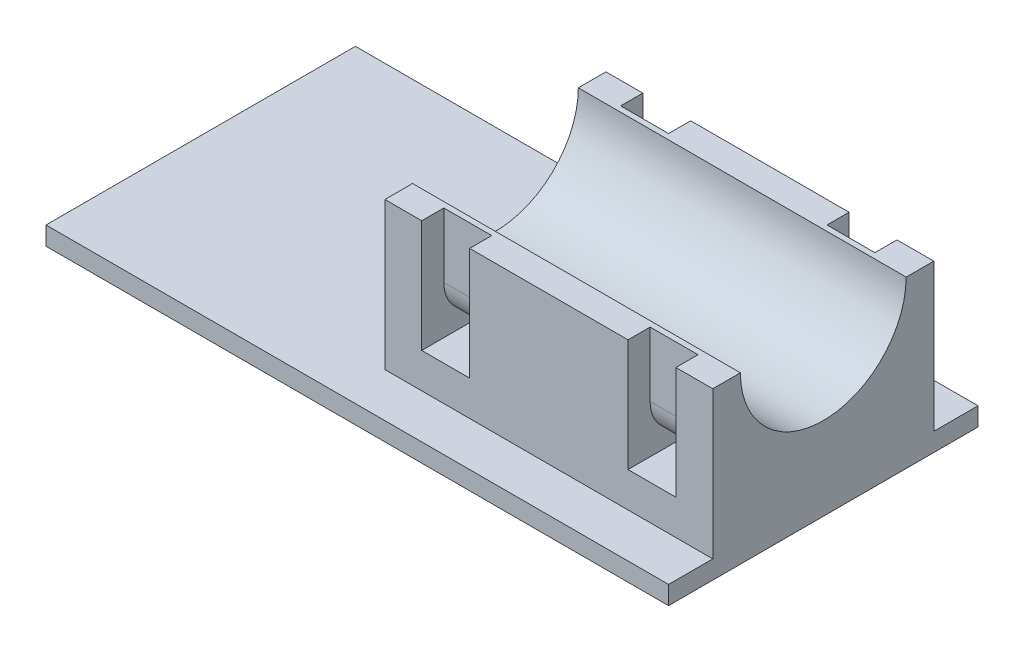
ISO-10303-21;
HEADER;
FILE_DESCRIPTION(('STEP AP214'),'2;1');
FILE_NAME('part.step','',(''),(''),'','','');
FILE_SCHEMA(('AUTOMOTIVE_DESIGN { 1 0 10303 214 1 1 1 1 }'));
ENDSEC;
DATA;
#1=APPLICATION_CONTEXT('core data for automotive mechanical design processes');
#2=APPLICATION_PROTOCOL_DEFINITION('international standard','automotive_design',2000,#1);
#3=PRODUCT_CONTEXT('',#1,'mechanical');
#4=PRODUCT('Part','Part','',(#3));
#5=PRODUCT_RELATED_PRODUCT_CATEGORY('part','',(#4));
#6=PRODUCT_DEFINITION_FORMATION('','',#4);
#7=PRODUCT_DEFINITION_CONTEXT('part definition',#1,'design');
#8=PRODUCT_DEFINITION('design','',#6,#7);
#9=PRODUCT_DEFINITION_SHAPE('','',#8);
#10=(LENGTH_UNIT() NAMED_UNIT(*) SI_UNIT(.MILLI.,.METRE.));
#11=(NAMED_UNIT(*) PLANE_ANGLE_UNIT() SI_UNIT($,.RADIAN.));
#12=(NAMED_UNIT(*) SI_UNIT($,.STERADIAN.) SOLID_ANGLE_UNIT());
#13=UNCERTAINTY_MEASURE_WITH_UNIT(LENGTH_MEASURE(1.E-05),#10,'distance_accuracy_value','');
#14=(GEOMETRIC_REPRESENTATION_CONTEXT(3) GLOBAL_UNCERTAINTY_ASSIGNED_CONTEXT((#13)) GLOBAL_UNIT_ASSIGNED_CONTEXT((#10,
#11,#12)) REPRESENTATION_CONTEXT('',''));
#15=CARTESIAN_POINT('',(0.,0.,0.));
#16=DIRECTION('',(0.,0.,1.));
#17=DIRECTION('',(1.,0.,0.));
#18=AXIS2_PLACEMENT_3D('',#15,#16,#17);
#19=CARTESIAN_POINT('',(0.,45.,0.));
#20=DIRECTION('',(0.,1.,0.));
#21=DIRECTION('',(0.,0.,1.));
#22=AXIS2_PLACEMENT_3D('',#19,#20,#21);
#23=PLANE('',#22);
#24=DIRECTION('',(-1.,0.,0.));
#25=VECTOR('',#24,1.);
#26=CARTESIAN_POINT('',(5.50000000000002,45.,-24.));
#27=LINE('',#26,#25);
#28=CARTESIAN_POINT('',(18.5,45.,-24.));
#29=VERTEX_POINT('',#28);
#30=CARTESIAN_POINT('',(5.50000000000002,45.,-24.));
#31=VERTEX_POINT('',#30);
#32=EDGE_CURVE('E254',#29,#31,#27,.T.);
#33=ORIENTED_EDGE('',*,*,#32,.T.);
#34=DIRECTION('',(0.,0.,-1.));
#35=VECTOR('',#34,1.);
#36=CARTESIAN_POINT('',(5.50000000000002,45.,-24.));
#37=LINE('',#36,#35);
#38=CARTESIAN_POINT('',(5.50000000000002,45.,-30.));
#39=VERTEX_POINT('',#38);
#40=EDGE_CURVE('E239',#31,#39,#37,.T.);
#41=ORIENTED_EDGE('',*,*,#40,.T.);
#42=DIRECTION('',(-1.,0.,0.));
#43=VECTOR('',#42,1.);
#44=CARTESIAN_POINT('',(-4.49999999999998,45.,-30.));
#45=LINE('',#44,#43);
#46=CARTESIAN_POINT('',(-4.49999999999998,45.,-30.));
#47=VERTEX_POINT('',#46);
#48=EDGE_CURVE('E425',#39,#47,#45,.T.);
#49=ORIENTED_EDGE('',*,*,#48,.T.);
#50=DIRECTION('',(0.,0.,1.));
#51=VECTOR('',#50,1.);
#52=CARTESIAN_POINT('',(-4.49999999999998,45.,-30.));
#53=LINE('',#52,#51);
#54=CARTESIAN_POINT('',(-4.49999999999998,45.,-22.5));
#55=VERTEX_POINT('',#54);
#56=EDGE_CURVE('E409',#47,#55,#53,.T.);
#57=ORIENTED_EDGE('',*,*,#56,.T.);
#58=DIRECTION('',(-1.,0.,0.));
#59=VECTOR('',#58,1.);
#60=CARTESIAN_POINT('',(84.5,45.,-22.5));
#61=LINE('',#60,#59);
#62=CARTESIAN_POINT('',(84.5,45.,-22.5));
#63=VERTEX_POINT('',#62);
#64=EDGE_CURVE('E402',#63,#55,#61,.T.);
#65=ORIENTED_EDGE('',*,*,#64,.F.);
#66=DIRECTION('',(0.,0.,-1.));
#67=VECTOR('',#66,1.);
#68=CARTESIAN_POINT('',(84.5,45.,-30.));
#69=LINE('',#68,#67);
#70=CARTESIAN_POINT('',(84.5,45.,-30.));
#71=VERTEX_POINT('',#70);
#72=EDGE_CURVE('E419',#63,#71,#69,.T.);
#73=ORIENTED_EDGE('',*,*,#72,.T.);
#74=CARTESIAN_POINT('',(74.5,45.,-30.));
#75=VERTEX_POINT('',#74);
#76=EDGE_CURVE('E426',#71,#75,#45,.T.);
#77=ORIENTED_EDGE('',*,*,#76,.T.);
#78=DIRECTION('',(0.,0.,-1.));
#79=VECTOR('',#78,1.);
#80=CARTESIAN_POINT('',(74.5,45.,-24.));
#81=LINE('',#80,#79);
#82=CARTESIAN_POINT('',(74.5,45.,-24.));
#83=VERTEX_POINT('',#82);
#84=EDGE_CURVE('E257',#83,#75,#81,.T.);
#85=ORIENTED_EDGE('',*,*,#84,.F.);
#86=DIRECTION('',(-1.,0.,0.));
#87=VECTOR('',#86,1.);
#88=CARTESIAN_POINT('',(61.5,45.,-24.));
#89=LINE('',#88,#87);
#90=CARTESIAN_POINT('',(61.5,45.,-24.));
#91=VERTEX_POINT('',#90);
#92=EDGE_CURVE('E273',#83,#91,#89,.T.);
#93=ORIENTED_EDGE('',*,*,#92,.T.);
#94=DIRECTION('',(0.,0.,-1.));
#95=VECTOR('',#94,1.);
#96=CARTESIAN_POINT('',(61.5,45.,-24.));
#97=LINE('',#96,#95);
#98=CARTESIAN_POINT('',(61.5,45.,-30.));
#99=VERTEX_POINT('',#98);
#100=EDGE_CURVE('E280',#91,#99,#97,.T.);
#101=ORIENTED_EDGE('',*,*,#100,.T.);
#102=CARTESIAN_POINT('',(18.5,45.,-30.));
#103=VERTEX_POINT('',#102);
#104=EDGE_CURVE('E431',#99,#103,#45,.T.);
#105=ORIENTED_EDGE('',*,*,#104,.T.);
#106=DIRECTION('',(0.,0.,-1.));
#107=VECTOR('',#106,1.);
#108=CARTESIAN_POINT('',(18.5,45.,-24.));
#109=LINE('',#108,#107);
#110=EDGE_CURVE('E249',#29,#103,#109,.T.);
#111=ORIENTED_EDGE('',*,*,#110,.F.);
#112=EDGE_LOOP('',(#33,#41,#49,#57,#65,#73,#77,#85,#93,#101,#105,#111));
#113=FACE_BOUND('',#112,.T.);
#114=ADVANCED_FACE('F43',(#113),#23,.T.);
#115=CARTESIAN_POINT('',(-4.49999999999998,45.,-30.));
#116=DIRECTION('',(0.,0.,1.));
#117=DIRECTION('',(1.,0.,0.));
#118=AXIS2_PLACEMENT_3D('',#115,#116,#117);
#119=PLANE('',#118);
#120=ORIENTED_EDGE('',*,*,#48,.F.);
#121=DIRECTION('',(0.,1.,0.));
#122=VECTOR('',#121,1.);
#123=CARTESIAN_POINT('',(5.50000000000002,17.5,-30.));
#124=LINE('',#123,#122);
#125=CARTESIAN_POINT('',(5.50000000000002,14.5,-30.));
#126=VERTEX_POINT('',#125);
#127=EDGE_CURVE('E244',#126,#39,#124,.T.);
#128=ORIENTED_EDGE('',*,*,#127,.F.);
#129=DIRECTION('',(-1.,0.,0.));
#130=VECTOR('',#129,1.);
#131=CARTESIAN_POINT('',(18.5,14.5,-30.));
#132=LINE('',#131,#130);
#133=CARTESIAN_POINT('',(18.5,14.5,-30.));
#134=VERTEX_POINT('',#133);
#135=EDGE_CURVE('E328',#134,#126,#132,.T.);
#136=ORIENTED_EDGE('',*,*,#135,.F.);
#137=DIRECTION('',(0.,-1.,0.));
#138=VECTOR('',#137,1.);
#139=CARTESIAN_POINT('',(18.5,17.5,-30.));
#140=LINE('',#139,#138);
#141=EDGE_CURVE('E325',#103,#134,#140,.T.);
#142=ORIENTED_EDGE('',*,*,#141,.F.);
#143=ORIENTED_EDGE('',*,*,#104,.F.);
#144=DIRECTION('',(0.,1.,0.));
#145=VECTOR('',#144,1.);
#146=CARTESIAN_POINT('',(61.5,17.5,-30.));
#147=LINE('',#146,#145);
#148=CARTESIAN_POINT('',(61.5,14.5,-30.));
#149=VERTEX_POINT('',#148);
#150=EDGE_CURVE('E354',#149,#99,#147,.T.);
#151=ORIENTED_EDGE('',*,*,#150,.F.);
#152=DIRECTION('',(-1.,0.,0.));
#153=VECTOR('',#152,1.);
#154=CARTESIAN_POINT('',(74.5,14.5,-30.));
#155=LINE('',#154,#153);
#156=CARTESIAN_POINT('',(74.5,14.5,-30.));
#157=VERTEX_POINT('',#156);
#158=EDGE_CURVE('E367',#157,#149,#155,.T.);
#159=ORIENTED_EDGE('',*,*,#158,.F.);
#160=DIRECTION('',(0.,-1.,0.));
#161=VECTOR('',#160,1.);
#162=CARTESIAN_POINT('',(74.5,17.5,-30.));
#163=LINE('',#162,#161);
#164=EDGE_CURVE('E329',#75,#157,#163,.T.);
#165=ORIENTED_EDGE('',*,*,#164,.F.);
#166=ORIENTED_EDGE('',*,*,#76,.F.);
#167=DIRECTION('',(0.,-1.,0.));
#168=VECTOR('',#167,1.);
#169=CARTESIAN_POINT('',(84.5,45.,-30.));
#170=LINE('',#169,#168);
#171=CARTESIAN_POINT('',(84.5,5.,-30.));
#172=VERTEX_POINT('',#171);
#173=EDGE_CURVE('E446',#71,#172,#170,.T.);
#174=ORIENTED_EDGE('',*,*,#173,.T.);
#175=DIRECTION('',(-1.,0.,0.));
#176=VECTOR('',#175,1.);
#177=CARTESIAN_POINT('',(-4.49999999999998,5.,-30.));
#178=LINE('',#177,#176);
#179=CARTESIAN_POINT('',(-4.49999999999998,5.,-30.));
#180=VERTEX_POINT('',#179);
#181=EDGE_CURVE('E439',#172,#180,#178,.T.);
#182=ORIENTED_EDGE('',*,*,#181,.T.);
#183=DIRECTION('',(0.,-1.,0.));
#184=VECTOR('',#183,1.);
#185=CARTESIAN_POINT('',(-4.49999999999998,45.,-30.));
#186=LINE('',#185,#184);
#187=EDGE_CURVE('E430',#47,#180,#186,.T.);
#188=ORIENTED_EDGE('',*,*,#187,.F.);
#189=EDGE_LOOP('',(#120,#128,#136,#142,#143,#151,#159,#165,#166,#174,#182,#188));
#190=FACE_BOUND('',#189,.T.);
#191=ADVANCED_FACE('F571',(#190),#119,.F.);
#192=CARTESIAN_POINT('',(0.,5.,0.));
#193=DIRECTION('',(0.,-1.,0.));
#194=DIRECTION('',(0.,0.,-1.));
#195=AXIS2_PLACEMENT_3D('',#192,#193,#194);
#196=PLANE('',#195);
#197=ORIENTED_EDGE('',*,*,#181,.F.);
#198=DIRECTION('',(0.,0.,-1.));
#199=VECTOR('',#198,1.);
#200=CARTESIAN_POINT('',(84.5,5.,42.));
#201=LINE('',#200,#199);
#202=CARTESIAN_POINT('',(84.5,5.,-42.));
#203=VERTEX_POINT('',#202);
#204=EDGE_CURVE('E463',#172,#203,#201,.T.);
#205=ORIENTED_EDGE('',*,*,#204,.T.);
#206=DIRECTION('',(-1.,0.,0.));
#207=VECTOR('',#206,1.);
#208=CARTESIAN_POINT('',(-84.5,5.,-42.));
#209=LINE('',#208,#207);
#210=CARTESIAN_POINT('',(-84.5,5.,-42.));
#211=VERTEX_POINT('',#210);
#212=EDGE_CURVE('E462',#203,#211,#209,.T.);
#213=ORIENTED_EDGE('',*,*,#212,.T.);
#214=DIRECTION('',(0.,0.,1.));
#215=VECTOR('',#214,1.);
#216=CARTESIAN_POINT('',(-84.5,5.,42.));
#217=LINE('',#216,#215);
#218=CARTESIAN_POINT('',(-84.5,5.,42.));
#219=VERTEX_POINT('',#218);
#220=EDGE_CURVE('E466',#211,#219,#217,.T.);
#221=ORIENTED_EDGE('',*,*,#220,.T.);
#222=DIRECTION('',(1.,0.,0.));
#223=VECTOR('',#222,1.);
#224=CARTESIAN_POINT('',(-84.5,5.,42.));
#225=LINE('',#224,#223);
#226=CARTESIAN_POINT('',(84.5,5.,42.));
#227=VERTEX_POINT('',#226);
#228=EDGE_CURVE('E469',#219,#227,#225,.T.);
#229=ORIENTED_EDGE('',*,*,#228,.T.);
#230=CARTESIAN_POINT('',(84.5,5.,30.));
#231=VERTEX_POINT('',#230);
#232=EDGE_CURVE('E459',#227,#231,#201,.T.);
#233=ORIENTED_EDGE('',*,*,#232,.T.);
#234=DIRECTION('',(1.,0.,0.));
#235=VECTOR('',#234,1.);
#236=CARTESIAN_POINT('',(-4.49999999999998,5.,30.));
#237=LINE('',#236,#235);
#238=CARTESIAN_POINT('',(-4.49999999999998,5.,30.));
#239=VERTEX_POINT('',#238);
#240=EDGE_CURVE('E435',#239,#231,#237,.T.);
#241=ORIENTED_EDGE('',*,*,#240,.F.);
#242=DIRECTION('',(0.,0.,1.));
#243=VECTOR('',#242,1.);
#244=CARTESIAN_POINT('',(-4.49999999999998,5.,-30.));
#245=LINE('',#244,#243);
#246=EDGE_CURVE('E405',#180,#239,#245,.T.);
#247=ORIENTED_EDGE('',*,*,#246,.F.);
#248=EDGE_LOOP('',(#197,#205,#213,#221,#229,#233,#241,#247));
#249=FACE_BOUND('',#248,.T.);
#250=ADVANCED_FACE('F568',(#249),#196,.F.);
#251=CARTESIAN_POINT('',(84.5,5.,42.));
#252=DIRECTION('',(-1.,0.,0.));
#253=DIRECTION('',(0.,0.,1.));
#254=AXIS2_PLACEMENT_3D('',#251,#252,#253);
#255=PLANE('',#254);
#256=ORIENTED_EDGE('',*,*,#72,.F.);
#257=CARTESIAN_POINT('',(84.5,45.,0.));
#258=DIRECTION('',(-1.,0.,0.));
#259=DIRECTION('',(0.,0.,1.));
#260=AXIS2_PLACEMENT_3D('',#257,#258,#259);
#261=CIRCLE('',#260,22.5);
#262=CARTESIAN_POINT('',(84.5,45.,22.5));
#263=VERTEX_POINT('',#262);
#264=EDGE_CURVE('E395',#63,#263,#261,.T.);
#265=ORIENTED_EDGE('',*,*,#264,.T.);
#266=CARTESIAN_POINT('',(84.5,45.,30.));
#267=VERTEX_POINT('',#266);
#268=EDGE_CURVE('E421',#267,#263,#69,.T.);
#269=ORIENTED_EDGE('',*,*,#268,.F.);
#270=DIRECTION('',(0.,-1.,0.));
#271=VECTOR('',#270,1.);
#272=CARTESIAN_POINT('',(84.5,45.,30.));
#273=LINE('',#272,#271);
#274=EDGE_CURVE('E450',#267,#231,#273,.T.);
#275=ORIENTED_EDGE('',*,*,#274,.T.);
#276=ORIENTED_EDGE('',*,*,#232,.F.);
#277=DIRECTION('',(0.,-1.,0.));
#278=VECTOR('',#277,1.);
#279=CARTESIAN_POINT('',(84.5,5.,42.));
#280=LINE('',#279,#278);
#281=CARTESIAN_POINT('',(84.5,0.,42.));
#282=VERTEX_POINT('',#281);
#283=EDGE_CURVE('E472',#227,#282,#280,.T.);
#284=ORIENTED_EDGE('',*,*,#283,.T.);
#285=DIRECTION('',(0.,0.,-1.));
#286=VECTOR('',#285,1.);
#287=CARTESIAN_POINT('',(84.5,0.,42.));
#288=LINE('',#287,#286);
#289=CARTESIAN_POINT('',(84.5,0.,-42.));
#290=VERTEX_POINT('',#289);
#291=EDGE_CURVE('E458',#282,#290,#288,.T.);
#292=ORIENTED_EDGE('',*,*,#291,.T.);
#293=DIRECTION('',(0.,-1.,0.));
#294=VECTOR('',#293,1.);
#295=CARTESIAN_POINT('',(84.5,5.,-42.));
#296=LINE('',#295,#294);
#297=EDGE_CURVE('E496',#203,#290,#296,.T.);
#298=ORIENTED_EDGE('',*,*,#297,.F.);
#299=ORIENTED_EDGE('',*,*,#204,.F.);
#300=ORIENTED_EDGE('',*,*,#173,.F.);
#301=EDGE_LOOP('',(#256,#265,#269,#275,#276,#284,#292,#298,#299,#300));
#302=FACE_BOUND('',#301,.T.);
#303=ADVANCED_FACE('F576',(#302),#255,.F.);
#304=CARTESIAN_POINT('',(-84.5,5.,-42.));
#305=DIRECTION('',(0.,0.,1.));
#306=DIRECTION('',(1.,0.,0.));
#307=AXIS2_PLACEMENT_3D('',#304,#305,#306);
#308=PLANE('',#307);
#309=DIRECTION('',(-1.,0.,0.));
#310=VECTOR('',#309,1.);
#311=CARTESIAN_POINT('',(-84.5,0.,-42.));
#312=LINE('',#311,#310);
#313=CARTESIAN_POINT('',(-84.5,0.,-42.));
#314=VERTEX_POINT('',#313);
#315=EDGE_CURVE('E476',#290,#314,#312,.T.);
#316=ORIENTED_EDGE('',*,*,#315,.T.);
#317=DIRECTION('',(0.,-1.,0.));
#318=VECTOR('',#317,1.);
#319=CARTESIAN_POINT('',(-84.5,5.,-42.));
#320=LINE('',#319,#318);
#321=EDGE_CURVE('E492',#211,#314,#320,.T.);
#322=ORIENTED_EDGE('',*,*,#321,.F.);
#323=ORIENTED_EDGE('',*,*,#212,.F.);
#324=ORIENTED_EDGE('',*,*,#297,.T.);
#325=EDGE_LOOP('',(#316,#322,#323,#324));
#326=FACE_BOUND('',#325,.T.);
#327=ADVANCED_FACE('F581',(#326),#308,.F.);
#328=CARTESIAN_POINT('',(-84.5,5.,42.));
#329=DIRECTION('',(1.,0.,0.));
#330=DIRECTION('',(0.,0.,-1.));
#331=AXIS2_PLACEMENT_3D('',#328,#329,#330);
#332=PLANE('',#331);
#333=DIRECTION('',(0.,0.,1.));
#334=VECTOR('',#333,1.);
#335=CARTESIAN_POINT('',(-84.5,0.,42.));
#336=LINE('',#335,#334);
#337=CARTESIAN_POINT('',(-84.5,0.,42.));
#338=VERTEX_POINT('',#337);
#339=EDGE_CURVE('E479',#314,#338,#336,.T.);
#340=ORIENTED_EDGE('',*,*,#339,.T.);
#341=DIRECTION('',(0.,-1.,0.));
#342=VECTOR('',#341,1.);
#343=CARTESIAN_POINT('',(-84.5,5.,42.));
#344=LINE('',#343,#342);
#345=EDGE_CURVE('E488',#219,#338,#344,.T.);
#346=ORIENTED_EDGE('',*,*,#345,.F.);
#347=ORIENTED_EDGE('',*,*,#220,.F.);
#348=ORIENTED_EDGE('',*,*,#321,.T.);
#349=EDGE_LOOP('',(#340,#346,#347,#348));
#350=FACE_BOUND('',#349,.T.);
#351=ADVANCED_FACE('F586',(#350),#332,.F.);
#352=CARTESIAN_POINT('',(-84.5,5.,42.));
#353=DIRECTION('',(0.,0.,-1.));
#354=DIRECTION('',(-1.,0.,0.));
#355=AXIS2_PLACEMENT_3D('',#352,#353,#354);
#356=PLANE('',#355);
#357=DIRECTION('',(1.,0.,0.));
#358=VECTOR('',#357,1.);
#359=CARTESIAN_POINT('',(-84.5,0.,42.));
#360=LINE('',#359,#358);
#361=EDGE_CURVE('E482',#338,#282,#360,.T.);
#362=ORIENTED_EDGE('',*,*,#361,.T.);
#363=ORIENTED_EDGE('',*,*,#283,.F.);
#364=ORIENTED_EDGE('',*,*,#228,.F.);
#365=ORIENTED_EDGE('',*,*,#345,.T.);
#366=EDGE_LOOP('',(#362,#363,#364,#365));
#367=FACE_BOUND('',#366,.T.);
#368=ADVANCED_FACE('F591',(#367),#356,.F.);
#369=CARTESIAN_POINT('',(0.,0.,0.));
#370=DIRECTION('',(0.,-1.,0.));
#371=DIRECTION('',(0.,0.,-1.));
#372=AXIS2_PLACEMENT_3D('',#369,#370,#371);
#373=PLANE('',#372);
#374=ORIENTED_EDGE('',*,*,#291,.F.);
#375=ORIENTED_EDGE('',*,*,#361,.F.);
#376=ORIENTED_EDGE('',*,*,#339,.F.);
#377=ORIENTED_EDGE('',*,*,#315,.F.);
#378=EDGE_LOOP('',(#374,#375,#376,#377));
#379=FACE_BOUND('',#378,.T.);
#380=ADVANCED_FACE('F665',(#379),#373,.T.);
#381=CARTESIAN_POINT('',(-4.49999999999998,45.,-30.));
#382=DIRECTION('',(1.,0.,0.));
#383=DIRECTION('',(0.,0.,-1.));
#384=AXIS2_PLACEMENT_3D('',#381,#382,#383);
#385=PLANE('',#384);
#386=CARTESIAN_POINT('',(-4.49999999999998,45.,22.5));
#387=VERTEX_POINT('',#386);
#388=CARTESIAN_POINT('',(-4.49999999999998,45.,30.));
#389=VERTEX_POINT('',#388);
#390=EDGE_CURVE('E414',#387,#389,#53,.T.);
#391=ORIENTED_EDGE('',*,*,#390,.F.);
#392=CARTESIAN_POINT('',(-4.49999999999998,45.,0.));
#393=DIRECTION('',(-1.,0.,0.));
#394=DIRECTION('',(0.,0.,1.));
#395=AXIS2_PLACEMENT_3D('',#392,#393,#394);
#396=CIRCLE('',#395,22.5);
#397=EDGE_CURVE('E394',#55,#387,#396,.T.);
#398=ORIENTED_EDGE('',*,*,#397,.F.);
#399=ORIENTED_EDGE('',*,*,#56,.F.);
#400=ORIENTED_EDGE('',*,*,#187,.T.);
#401=ORIENTED_EDGE('',*,*,#246,.T.);
#402=DIRECTION('',(0.,-1.,0.));
#403=VECTOR('',#402,1.);
#404=CARTESIAN_POINT('',(-4.49999999999998,45.,30.));
#405=LINE('',#404,#403);
#406=EDGE_CURVE('E454',#389,#239,#405,.T.);
#407=ORIENTED_EDGE('',*,*,#406,.F.);
#408=EDGE_LOOP('',(#391,#398,#399,#400,#401,#407));
#409=FACE_BOUND('',#408,.T.);
#410=ADVANCED_FACE('F564',(#409),#385,.F.);
#411=CARTESIAN_POINT('',(-4.49999999999998,45.,30.));
#412=DIRECTION('',(0.,0.,-1.));
#413=DIRECTION('',(-1.,0.,0.));
#414=AXIS2_PLACEMENT_3D('',#411,#412,#413);
#415=PLANE('',#414);
#416=DIRECTION('',(0.,1.,0.));
#417=VECTOR('',#416,1.);
#418=CARTESIAN_POINT('',(5.50000000000002,45.,30.));
#419=LINE('',#418,#417);
#420=CARTESIAN_POINT('',(5.50000000000002,14.5,30.));
#421=VERTEX_POINT('',#420);
#422=CARTESIAN_POINT('',(5.50000000000002,45.,30.));
#423=VERTEX_POINT('',#422);
#424=EDGE_CURVE('E387',#421,#423,#419,.T.);
#425=ORIENTED_EDGE('',*,*,#424,.T.);
#426=DIRECTION('',(1.,0.,0.));
#427=VECTOR('',#426,1.);
#428=CARTESIAN_POINT('',(-4.49999999999998,45.,30.));
#429=LINE('',#428,#427);
#430=EDGE_CURVE('E415',#389,#423,#429,.T.);
#431=ORIENTED_EDGE('',*,*,#430,.F.);
#432=ORIENTED_EDGE('',*,*,#406,.T.);
#433=ORIENTED_EDGE('',*,*,#240,.T.);
#434=ORIENTED_EDGE('',*,*,#274,.F.);
#435=CARTESIAN_POINT('',(74.5,45.,30.));
#436=VERTEX_POINT('',#435);
#437=EDGE_CURVE('E413',#436,#267,#429,.T.);
#438=ORIENTED_EDGE('',*,*,#437,.F.);
#439=DIRECTION('',(0.,-1.,0.));
#440=VECTOR('',#439,1.);
#441=CARTESIAN_POINT('',(74.5,45.,30.));
#442=LINE('',#441,#440);
#443=CARTESIAN_POINT('',(74.5,14.5,30.));
#444=VERTEX_POINT('',#443);
#445=EDGE_CURVE('E379',#436,#444,#442,.T.);
#446=ORIENTED_EDGE('',*,*,#445,.T.);
#447=DIRECTION('',(-1.,0.,0.));
#448=VECTOR('',#447,1.);
#449=CARTESIAN_POINT('',(-4.49999999999998,14.5,30.));
#450=LINE('',#449,#448);
#451=CARTESIAN_POINT('',(61.5,14.5,30.));
#452=VERTEX_POINT('',#451);
#453=EDGE_CURVE('E339',#444,#452,#450,.T.);
#454=ORIENTED_EDGE('',*,*,#453,.T.);
#455=DIRECTION('',(0.,1.,0.));
#456=VECTOR('',#455,1.);
#457=CARTESIAN_POINT('',(61.5,45.,30.));
#458=LINE('',#457,#456);
#459=CARTESIAN_POINT('',(61.5,45.,30.));
#460=VERTEX_POINT('',#459);
#461=EDGE_CURVE('E376',#452,#460,#458,.T.);
#462=ORIENTED_EDGE('',*,*,#461,.T.);
#463=CARTESIAN_POINT('',(18.5,45.,30.));
#464=VERTEX_POINT('',#463);
#465=EDGE_CURVE('E420',#464,#460,#429,.T.);
#466=ORIENTED_EDGE('',*,*,#465,.F.);
#467=DIRECTION('',(0.,-1.,0.));
#468=VECTOR('',#467,1.);
#469=CARTESIAN_POINT('',(18.5,45.,30.));
#470=LINE('',#469,#468);
#471=CARTESIAN_POINT('',(18.5,14.5,30.));
#472=VERTEX_POINT('',#471);
#473=EDGE_CURVE('E390',#464,#472,#470,.T.);
#474=ORIENTED_EDGE('',*,*,#473,.T.);
#475=DIRECTION('',(-1.,0.,0.));
#476=VECTOR('',#475,1.);
#477=CARTESIAN_POINT('',(-4.49999999999998,14.5,30.));
#478=LINE('',#477,#476);
#479=EDGE_CURVE('E383',#472,#421,#478,.T.);
#480=ORIENTED_EDGE('',*,*,#479,.T.);
#481=EDGE_LOOP('',(#425,#431,#432,#433,#434,#438,#446,#454,#462,#466,#474,#480));
#482=FACE_BOUND('',#481,.T.);
#483=ADVANCED_FACE('F562',(#482),#415,.F.);
#484=DIRECTION('',(0.,0.,1.));
#485=VECTOR('',#484,1.);
#486=CARTESIAN_POINT('',(5.50000000000002,45.,24.));
#487=LINE('',#486,#485);
#488=CARTESIAN_POINT('',(5.50000000000002,45.,24.));
#489=VERTEX_POINT('',#488);
#490=EDGE_CURVE('E300',#489,#423,#487,.T.);
#491=ORIENTED_EDGE('',*,*,#490,.F.);
#492=DIRECTION('',(-1.,0.,0.));
#493=VECTOR('',#492,1.);
#494=CARTESIAN_POINT('',(5.50000000000002,45.,24.));
#495=LINE('',#494,#493);
#496=CARTESIAN_POINT('',(18.5,45.,24.));
#497=VERTEX_POINT('',#496);
#498=EDGE_CURVE('E295',#497,#489,#495,.T.);
#499=ORIENTED_EDGE('',*,*,#498,.F.);
#500=DIRECTION('',(0.,0.,1.));
#501=VECTOR('',#500,1.);
#502=CARTESIAN_POINT('',(18.5,45.,24.));
#503=LINE('',#502,#501);
#504=EDGE_CURVE('E299',#497,#464,#503,.T.);
#505=ORIENTED_EDGE('',*,*,#504,.T.);
#506=ORIENTED_EDGE('',*,*,#465,.T.);
#507=DIRECTION('',(0.,0.,1.));
#508=VECTOR('',#507,1.);
#509=CARTESIAN_POINT('',(61.5,45.,24.));
#510=LINE('',#509,#508);
#511=CARTESIAN_POINT('',(61.5,45.,24.));
#512=VERTEX_POINT('',#511);
#513=EDGE_CURVE('E267',#512,#460,#510,.T.);
#514=ORIENTED_EDGE('',*,*,#513,.F.);
#515=DIRECTION('',(-1.,0.,0.));
#516=VECTOR('',#515,1.);
#517=CARTESIAN_POINT('',(61.5,45.,24.));
#518=LINE('',#517,#516);
#519=CARTESIAN_POINT('',(74.5,45.,24.));
#520=VERTEX_POINT('',#519);
#521=EDGE_CURVE('E312',#520,#512,#518,.T.);
#522=ORIENTED_EDGE('',*,*,#521,.F.);
#523=DIRECTION('',(0.,0.,1.));
#524=VECTOR('',#523,1.);
#525=CARTESIAN_POINT('',(74.5,45.,24.));
#526=LINE('',#525,#524);
#527=EDGE_CURVE('E308',#520,#436,#526,.T.);
#528=ORIENTED_EDGE('',*,*,#527,.T.);
#529=ORIENTED_EDGE('',*,*,#437,.T.);
#530=ORIENTED_EDGE('',*,*,#268,.T.);
#531=DIRECTION('',(-1.,0.,0.));
#532=VECTOR('',#531,1.);
#533=CARTESIAN_POINT('',(84.5,45.,22.5));
#534=LINE('',#533,#532);
#535=EDGE_CURVE('E399',#263,#387,#534,.T.);
#536=ORIENTED_EDGE('',*,*,#535,.T.);
#537=ORIENTED_EDGE('',*,*,#390,.T.);
#538=ORIENTED_EDGE('',*,*,#430,.T.);
#539=EDGE_LOOP('',(#491,#499,#505,#506,#514,#522,#528,#529,#530,#536,#537,#538));
#540=FACE_BOUND('',#539,.T.);
#541=ADVANCED_FACE('F557',(#540),#23,.T.);
#542=CARTESIAN_POINT('',(84.5,45.,0.));
#543=DIRECTION('',(-1.,0.,0.));
#544=DIRECTION('',(0.,0.,1.));
#545=AXIS2_PLACEMENT_3D('',#542,#543,#544);
#546=CYLINDRICAL_SURFACE('',#545,22.5);
#547=ORIENTED_EDGE('',*,*,#397,.T.);
#548=ORIENTED_EDGE('',*,*,#535,.F.);
#549=ORIENTED_EDGE('',*,*,#264,.F.);
#550=ORIENTED_EDGE('',*,*,#64,.T.);
#551=EDGE_LOOP('',(#547,#548,#549,#550));
#552=FACE_BOUND('',#551,.T.);
#553=ADVANCED_FACE('F645',(#552),#546,.F.);
#554=CARTESIAN_POINT('',(74.5,17.5,42.));
#555=DIRECTION('',(1.,0.,0.));
#556=DIRECTION('',(0.,0.,-1.));
#557=AXIS2_PLACEMENT_3D('',#554,#555,#556);
#558=PLANE('',#557);
#559=ORIENTED_EDGE('',*,*,#445,.F.);
#560=ORIENTED_EDGE('',*,*,#527,.F.);
#561=DIRECTION('',(0.,1.,0.));
#562=VECTOR('',#561,1.);
#563=CARTESIAN_POINT('',(74.5,17.5,24.));
#564=LINE('',#563,#562);
#565=CARTESIAN_POINT('',(74.5,27.5,24.));
#566=VERTEX_POINT('',#565);
#567=EDGE_CURVE('E319',#566,#520,#564,.T.);
#568=ORIENTED_EDGE('',*,*,#567,.F.);
#569=CARTESIAN_POINT('',(74.5,27.5,14.));
#570=DIRECTION('',(1.,0.,0.));
#571=DIRECTION('',(0.,0.,-1.));
#572=AXIS2_PLACEMENT_3D('',#569,#570,#571);
#573=CIRCLE('',#572,10.);
#574=CARTESIAN_POINT('',(74.5,17.5,14.));
#575=VERTEX_POINT('',#574);
#576=EDGE_CURVE('E514',#566,#575,#573,.T.);
#577=ORIENTED_EDGE('',*,*,#576,.T.);
#578=DIRECTION('',(0.,0.,-1.));
#579=VECTOR('',#578,1.);
#580=CARTESIAN_POINT('',(74.5,17.5,42.));
#581=LINE('',#580,#579);
#582=CARTESIAN_POINT('',(74.5,17.5,-14.));
#583=VERTEX_POINT('',#582);
#584=EDGE_CURVE('E304',#575,#583,#581,.T.);
#585=ORIENTED_EDGE('',*,*,#584,.T.);
#586=CARTESIAN_POINT('',(74.5,27.5,-14.));
#587=DIRECTION('',(1.,0.,0.));
#588=DIRECTION('',(0.,0.,-1.));
#589=AXIS2_PLACEMENT_3D('',#586,#587,#588);
#590=CIRCLE('',#589,10.);
#591=CARTESIAN_POINT('',(74.5,27.5,-24.));
#592=VERTEX_POINT('',#591);
#593=EDGE_CURVE('E539',#583,#592,#590,.T.);
#594=ORIENTED_EDGE('',*,*,#593,.T.);
#595=DIRECTION('',(0.,1.,0.));
#596=VECTOR('',#595,1.);
#597=CARTESIAN_POINT('',(74.5,17.5,-24.));
#598=LINE('',#597,#596);
#599=EDGE_CURVE('E277',#592,#83,#598,.T.);
#600=ORIENTED_EDGE('',*,*,#599,.T.);
#601=ORIENTED_EDGE('',*,*,#84,.T.);
#602=ORIENTED_EDGE('',*,*,#164,.T.);
#603=DIRECTION('',(0.,0.,-1.));
#604=VECTOR('',#603,1.);
#605=CARTESIAN_POINT('',(74.5,14.5,42.));
#606=LINE('',#605,#604);
#607=EDGE_CURVE('E350',#444,#157,#606,.T.);
#608=ORIENTED_EDGE('',*,*,#607,.F.);
#609=EDGE_LOOP('',(#559,#560,#568,#577,#585,#594,#600,#601,#602,#608));
#610=FACE_BOUND('',#609,.T.);
#611=ADVANCED_FACE('F602',(#610),#558,.F.);
#612=CARTESIAN_POINT('',(74.5,17.5,42.));
#613=DIRECTION('',(0.,1.,0.));
#614=DIRECTION('',(0.,0.,1.));
#615=AXIS2_PLACEMENT_3D('',#612,#613,#614);
#616=PLANE('',#615);
#617=DIRECTION('',(0.,0.,-1.));
#618=VECTOR('',#617,1.);
#619=CARTESIAN_POINT('',(61.5,17.5,42.));
#620=LINE('',#619,#618);
#621=CARTESIAN_POINT('',(61.5,17.5,14.));
#622=VERTEX_POINT('',#621);
#623=CARTESIAN_POINT('',(61.5,17.5,-14.));
#624=VERTEX_POINT('',#623);
#625=EDGE_CURVE('E358',#622,#624,#620,.T.);
#626=ORIENTED_EDGE('',*,*,#625,.T.);
#627=DIRECTION('',(1.,0.,0.));
#628=VECTOR('',#627,1.);
#629=CARTESIAN_POINT('',(74.5,17.5,-14.));
#630=LINE('',#629,#628);
#631=EDGE_CURVE('E526',#624,#583,#630,.T.);
#632=ORIENTED_EDGE('',*,*,#631,.T.);
#633=ORIENTED_EDGE('',*,*,#584,.F.);
#634=DIRECTION('',(1.,0.,0.));
#635=VECTOR('',#634,1.);
#636=CARTESIAN_POINT('',(74.5,17.5,14.));
#637=LINE('',#636,#635);
#638=EDGE_CURVE('E504',#575,#622,#637,.F.);
#639=ORIENTED_EDGE('',*,*,#638,.T.);
#640=EDGE_LOOP('',(#626,#632,#633,#639));
#641=FACE_BOUND('',#640,.T.);
#642=ADVANCED_FACE('F626',(#641),#616,.F.);
#643=CARTESIAN_POINT('',(61.5,17.5,42.));
#644=DIRECTION('',(-1.,0.,0.));
#645=DIRECTION('',(0.,0.,1.));
#646=AXIS2_PLACEMENT_3D('',#643,#644,#645);
#647=PLANE('',#646);
#648=DIRECTION('',(0.,0.,-1.));
#649=VECTOR('',#648,1.);
#650=CARTESIAN_POINT('',(61.5,14.5,42.));
#651=LINE('',#650,#649);
#652=EDGE_CURVE('E355',#452,#149,#651,.T.);
#653=ORIENTED_EDGE('',*,*,#652,.T.);
#654=ORIENTED_EDGE('',*,*,#150,.T.);
#655=ORIENTED_EDGE('',*,*,#100,.F.);
#656=DIRECTION('',(0.,-1.,0.));
#657=VECTOR('',#656,1.);
#658=CARTESIAN_POINT('',(61.5,17.5,-24.));
#659=LINE('',#658,#657);
#660=CARTESIAN_POINT('',(61.5,27.5,-24.));
#661=VERTEX_POINT('',#660);
#662=EDGE_CURVE('E269',#91,#661,#659,.T.);
#663=ORIENTED_EDGE('',*,*,#662,.T.);
#664=CARTESIAN_POINT('',(61.5,27.5,-14.));
#665=DIRECTION('',(-1.,0.,0.));
#666=DIRECTION('',(0.,0.,1.));
#667=AXIS2_PLACEMENT_3D('',#664,#665,#666);
#668=CIRCLE('',#667,10.);
#669=EDGE_CURVE('E542',#661,#624,#668,.T.);
#670=ORIENTED_EDGE('',*,*,#669,.T.);
#671=ORIENTED_EDGE('',*,*,#625,.F.);
#672=CARTESIAN_POINT('',(61.5,27.5,14.));
#673=DIRECTION('',(-1.,0.,0.));
#674=DIRECTION('',(0.,0.,1.));
#675=AXIS2_PLACEMENT_3D('',#672,#673,#674);
#676=CIRCLE('',#675,10.);
#677=CARTESIAN_POINT('',(61.5,27.5,24.));
#678=VERTEX_POINT('',#677);
#679=EDGE_CURVE('E517',#622,#678,#676,.T.);
#680=ORIENTED_EDGE('',*,*,#679,.T.);
#681=DIRECTION('',(0.,-1.,0.));
#682=VECTOR('',#681,1.);
#683=CARTESIAN_POINT('',(61.5,17.5,24.));
#684=LINE('',#683,#682);
#685=EDGE_CURVE('E292',#512,#678,#684,.T.);
#686=ORIENTED_EDGE('',*,*,#685,.F.);
#687=ORIENTED_EDGE('',*,*,#513,.T.);
#688=ORIENTED_EDGE('',*,*,#461,.F.);
#689=EDGE_LOOP('',(#653,#654,#655,#663,#670,#671,#680,#686,#687,#688));
#690=FACE_BOUND('',#689,.T.);
#691=ADVANCED_FACE('F610',(#690),#647,.F.);
#692=CARTESIAN_POINT('',(74.5,14.5,42.));
#693=DIRECTION('',(0.,-1.,0.));
#694=DIRECTION('',(0.,0.,-1.));
#695=AXIS2_PLACEMENT_3D('',#692,#693,#694);
#696=PLANE('',#695);
#697=ORIENTED_EDGE('',*,*,#607,.T.);
#698=ORIENTED_EDGE('',*,*,#158,.T.);
#699=ORIENTED_EDGE('',*,*,#652,.F.);
#700=ORIENTED_EDGE('',*,*,#453,.F.);
#701=EDGE_LOOP('',(#697,#698,#699,#700));
#702=FACE_BOUND('',#701,.T.);
#703=ADVANCED_FACE('F606',(#702),#696,.F.);
#704=CARTESIAN_POINT('',(18.5,17.5,42.));
#705=DIRECTION('',(1.,0.,0.));
#706=DIRECTION('',(0.,0.,-1.));
#707=AXIS2_PLACEMENT_3D('',#704,#705,#706);
#708=PLANE('',#707);
#709=ORIENTED_EDGE('',*,*,#473,.F.);
#710=ORIENTED_EDGE('',*,*,#504,.F.);
#711=DIRECTION('',(0.,1.,0.));
#712=VECTOR('',#711,1.);
#713=CARTESIAN_POINT('',(18.5,17.5,24.));
#714=LINE('',#713,#712);
#715=CARTESIAN_POINT('',(18.5,27.5,24.));
#716=VERTEX_POINT('',#715);
#717=EDGE_CURVE('E291',#716,#497,#714,.T.);
#718=ORIENTED_EDGE('',*,*,#717,.F.);
#719=CARTESIAN_POINT('',(18.5,27.5,14.));
#720=DIRECTION('',(1.,0.,0.));
#721=DIRECTION('',(0.,0.,-1.));
#722=AXIS2_PLACEMENT_3D('',#719,#720,#721);
#723=CIRCLE('',#722,10.);
#724=CARTESIAN_POINT('',(18.5,17.5,14.));
#725=VERTEX_POINT('',#724);
#726=EDGE_CURVE('E520',#716,#725,#723,.T.);
#727=ORIENTED_EDGE('',*,*,#726,.T.);
#728=DIRECTION('',(0.,0.,-1.));
#729=VECTOR('',#728,1.);
#730=CARTESIAN_POINT('',(18.5,17.5,42.));
#731=LINE('',#730,#729);
#732=CARTESIAN_POINT('',(18.5,17.5,-14.));
#733=VERTEX_POINT('',#732);
#734=EDGE_CURVE('E336',#725,#733,#731,.T.);
#735=ORIENTED_EDGE('',*,*,#734,.T.);
#736=CARTESIAN_POINT('',(18.5,27.5,-14.));
#737=DIRECTION('',(1.,0.,0.));
#738=DIRECTION('',(0.,0.,-1.));
#739=AXIS2_PLACEMENT_3D('',#736,#737,#738);
#740=CIRCLE('',#739,10.);
#741=CARTESIAN_POINT('',(18.5,27.5,-24.));
#742=VERTEX_POINT('',#741);
#743=EDGE_CURVE('E52',#733,#742,#740,.T.);
#744=ORIENTED_EDGE('',*,*,#743,.T.);
#745=DIRECTION('',(0.,1.,0.));
#746=VECTOR('',#745,1.);
#747=CARTESIAN_POINT('',(18.5,17.5,-24.));
#748=LINE('',#747,#746);
#749=EDGE_CURVE('E250',#742,#29,#748,.T.);
#750=ORIENTED_EDGE('',*,*,#749,.T.);
#751=ORIENTED_EDGE('',*,*,#110,.T.);
#752=ORIENTED_EDGE('',*,*,#141,.T.);
#753=DIRECTION('',(0.,0.,-1.));
#754=VECTOR('',#753,1.);
#755=CARTESIAN_POINT('',(18.5,14.5,42.));
#756=LINE('',#755,#754);
#757=EDGE_CURVE('E335',#472,#134,#756,.T.);
#758=ORIENTED_EDGE('',*,*,#757,.F.);
#759=EDGE_LOOP('',(#709,#710,#718,#727,#735,#744,#750,#751,#752,#758));
#760=FACE_BOUND('',#759,.T.);
#761=ADVANCED_FACE('F638',(#760),#708,.F.);
#762=CARTESIAN_POINT('',(18.5,17.5,42.));
#763=DIRECTION('',(0.,1.,0.));
#764=DIRECTION('',(0.,0.,1.));
#765=AXIS2_PLACEMENT_3D('',#762,#763,#764);
#766=PLANE('',#765);
#767=DIRECTION('',(0.,0.,-1.));
#768=VECTOR('',#767,1.);
#769=CARTESIAN_POINT('',(5.50000000000002,17.5,42.));
#770=LINE('',#769,#768);
#771=CARTESIAN_POINT('',(5.50000000000002,17.5,14.));
#772=VERTEX_POINT('',#771);
#773=CARTESIAN_POINT('',(5.50000000000002,17.5,-14.));
#774=VERTEX_POINT('',#773);
#775=EDGE_CURVE('E340',#772,#774,#770,.T.);
#776=ORIENTED_EDGE('',*,*,#775,.T.);
#777=DIRECTION('',(1.,0.,0.));
#778=VECTOR('',#777,1.);
#779=CARTESIAN_POINT('',(18.5,17.5,-14.));
#780=LINE('',#779,#778);
#781=EDGE_CURVE('E533',#774,#733,#780,.T.);
#782=ORIENTED_EDGE('',*,*,#781,.T.);
#783=ORIENTED_EDGE('',*,*,#734,.F.);
#784=DIRECTION('',(1.,0.,0.));
#785=VECTOR('',#784,1.);
#786=CARTESIAN_POINT('',(18.5,17.5,14.));
#787=LINE('',#786,#785);
#788=EDGE_CURVE('E511',#725,#772,#787,.F.);
#789=ORIENTED_EDGE('',*,*,#788,.T.);
#790=EDGE_LOOP('',(#776,#782,#783,#789));
#791=FACE_BOUND('',#790,.T.);
#792=ADVANCED_FACE('F702',(#791),#766,.F.);
#793=CARTESIAN_POINT('',(5.50000000000002,17.5,42.));
#794=DIRECTION('',(-1.,0.,0.));
#795=DIRECTION('',(0.,0.,1.));
#796=AXIS2_PLACEMENT_3D('',#793,#794,#795);
#797=PLANE('',#796);
#798=DIRECTION('',(0.,0.,-1.));
#799=VECTOR('',#798,1.);
#800=CARTESIAN_POINT('',(5.50000000000002,14.5,42.));
#801=LINE('',#800,#799);
#802=EDGE_CURVE('E344',#421,#126,#801,.T.);
#803=ORIENTED_EDGE('',*,*,#802,.T.);
#804=ORIENTED_EDGE('',*,*,#127,.T.);
#805=ORIENTED_EDGE('',*,*,#40,.F.);
#806=DIRECTION('',(0.,-1.,0.));
#807=VECTOR('',#806,1.);
#808=CARTESIAN_POINT('',(5.50000000000002,17.5,-24.));
#809=LINE('',#808,#807);
#810=CARTESIAN_POINT('',(5.50000000000002,27.5,-24.));
#811=VERTEX_POINT('',#810);
#812=EDGE_CURVE('E241',#31,#811,#809,.T.);
#813=ORIENTED_EDGE('',*,*,#812,.T.);
#814=CARTESIAN_POINT('',(5.50000000000002,27.5,-14.));
#815=DIRECTION('',(-1.,0.,0.));
#816=DIRECTION('',(0.,0.,1.));
#817=AXIS2_PLACEMENT_3D('',#814,#815,#816);
#818=CIRCLE('',#817,10.);
#819=EDGE_CURVE('E11',#811,#774,#818,.T.);
#820=ORIENTED_EDGE('',*,*,#819,.T.);
#821=ORIENTED_EDGE('',*,*,#775,.F.);
#822=CARTESIAN_POINT('',(5.50000000000002,27.5,14.));
#823=DIRECTION('',(-1.,0.,0.));
#824=DIRECTION('',(0.,0.,1.));
#825=AXIS2_PLACEMENT_3D('',#822,#823,#824);
#826=CIRCLE('',#825,10.);
#827=CARTESIAN_POINT('',(5.50000000000002,27.5,24.));
#828=VERTEX_POINT('',#827);
#829=EDGE_CURVE('E523',#772,#828,#826,.T.);
#830=ORIENTED_EDGE('',*,*,#829,.T.);
#831=DIRECTION('',(0.,-1.,0.));
#832=VECTOR('',#831,1.);
#833=CARTESIAN_POINT('',(5.50000000000002,17.5,24.));
#834=LINE('',#833,#832);
#835=EDGE_CURVE('E287',#489,#828,#834,.T.);
#836=ORIENTED_EDGE('',*,*,#835,.F.);
#837=ORIENTED_EDGE('',*,*,#490,.T.);
#838=ORIENTED_EDGE('',*,*,#424,.F.);
#839=EDGE_LOOP('',(#803,#804,#805,#813,#820,#821,#830,#836,#837,#838));
#840=FACE_BOUND('',#839,.T.);
#841=ADVANCED_FACE('F240',(#840),#797,.F.);
#842=CARTESIAN_POINT('',(18.5,14.5,42.));
#843=DIRECTION('',(0.,-1.,0.));
#844=DIRECTION('',(0.,0.,-1.));
#845=AXIS2_PLACEMENT_3D('',#842,#843,#844);
#846=PLANE('',#845);
#847=ORIENTED_EDGE('',*,*,#757,.T.);
#848=ORIENTED_EDGE('',*,*,#135,.T.);
#849=ORIENTED_EDGE('',*,*,#802,.F.);
#850=ORIENTED_EDGE('',*,*,#479,.F.);
#851=EDGE_LOOP('',(#847,#848,#849,#850));
#852=FACE_BOUND('',#851,.T.);
#853=ADVANCED_FACE('F642',(#852),#846,.F.);
#854=CARTESIAN_POINT('',(0.,0.,24.));
#855=DIRECTION('',(0.,0.,-1.));
#856=DIRECTION('',(-1.,0.,0.));
#857=AXIS2_PLACEMENT_3D('',#854,#855,#856);
#858=PLANE('',#857);
#859=ORIENTED_EDGE('',*,*,#835,.T.);
#860=DIRECTION('',(1.,0.,0.));
#861=VECTOR('',#860,1.);
#862=CARTESIAN_POINT('',(0.,27.5,24.));
#863=LINE('',#862,#861);
#864=EDGE_CURVE('E507',#828,#716,#863,.T.);
#865=ORIENTED_EDGE('',*,*,#864,.T.);
#866=ORIENTED_EDGE('',*,*,#717,.T.);
#867=ORIENTED_EDGE('',*,*,#498,.T.);
#868=EDGE_LOOP('',(#859,#865,#866,#867));
#869=FACE_BOUND('',#868,.T.);
#870=ADVANCED_FACE('F696',(#869),#858,.F.);
#871=CARTESIAN_POINT('',(0.,0.,24.));
#872=DIRECTION('',(0.,0.,-1.));
#873=DIRECTION('',(-1.,0.,0.));
#874=AXIS2_PLACEMENT_3D('',#871,#872,#873);
#875=PLANE('',#874);
#876=ORIENTED_EDGE('',*,*,#685,.T.);
#877=DIRECTION('',(1.,0.,0.));
#878=VECTOR('',#877,1.);
#879=CARTESIAN_POINT('',(0.,27.5,24.));
#880=LINE('',#879,#878);
#881=EDGE_CURVE('E500',#678,#566,#880,.T.);
#882=ORIENTED_EDGE('',*,*,#881,.T.);
#883=ORIENTED_EDGE('',*,*,#567,.T.);
#884=ORIENTED_EDGE('',*,*,#521,.T.);
#885=EDGE_LOOP('',(#876,#882,#883,#884));
#886=FACE_BOUND('',#885,.T.);
#887=ADVANCED_FACE('F633',(#886),#875,.F.);
#888=CARTESIAN_POINT('',(0.,27.5,14.));
#889=DIRECTION('',(1.,0.,0.));
#890=DIRECTION('',(0.,0.,-1.));
#891=AXIS2_PLACEMENT_3D('',#888,#889,#890);
#892=CYLINDRICAL_SURFACE('',#891,10.);
#893=ORIENTED_EDGE('',*,*,#679,.F.);
#894=ORIENTED_EDGE('',*,*,#638,.F.);
#895=ORIENTED_EDGE('',*,*,#576,.F.);
#896=ORIENTED_EDGE('',*,*,#881,.F.);
#897=EDGE_LOOP('',(#893,#894,#895,#896));
#898=FACE_BOUND('',#897,.T.);
#899=ADVANCED_FACE('F631',(#898),#892,.T.);
#900=CARTESIAN_POINT('',(0.,27.5,14.));
#901=DIRECTION('',(1.,0.,0.));
#902=DIRECTION('',(0.,0.,-1.));
#903=AXIS2_PLACEMENT_3D('',#900,#901,#902);
#904=CYLINDRICAL_SURFACE('',#903,10.);
#905=ORIENTED_EDGE('',*,*,#829,.F.);
#906=ORIENTED_EDGE('',*,*,#788,.F.);
#907=ORIENTED_EDGE('',*,*,#726,.F.);
#908=ORIENTED_EDGE('',*,*,#864,.F.);
#909=EDGE_LOOP('',(#905,#906,#907,#908));
#910=FACE_BOUND('',#909,.T.);
#911=ADVANCED_FACE('F681',(#910),#904,.T.);
#912=CARTESIAN_POINT('',(0.,0.,-24.));
#913=DIRECTION('',(0.,0.,1.));
#914=DIRECTION('',(-1.,0.,0.));
#915=AXIS2_PLACEMENT_3D('',#912,#913,#914);
#916=PLANE('',#915);
#917=ORIENTED_EDGE('',*,*,#749,.F.);
#918=DIRECTION('',(1.,0.,0.));
#919=VECTOR('',#918,1.);
#920=CARTESIAN_POINT('',(0.,27.5,-24.));
#921=LINE('',#920,#919);
#922=EDGE_CURVE('E65',#742,#811,#921,.F.);
#923=ORIENTED_EDGE('',*,*,#922,.T.);
#924=ORIENTED_EDGE('',*,*,#812,.F.);
#925=ORIENTED_EDGE('',*,*,#32,.F.);
#926=EDGE_LOOP('',(#917,#923,#924,#925));
#927=FACE_BOUND('',#926,.T.);
#928=ADVANCED_FACE('F253',(#927),#916,.F.);
#929=CARTESIAN_POINT('',(0.,0.,-24.));
#930=DIRECTION('',(0.,0.,1.));
#931=DIRECTION('',(-1.,0.,0.));
#932=AXIS2_PLACEMENT_3D('',#929,#930,#931);
#933=PLANE('',#932);
#934=ORIENTED_EDGE('',*,*,#599,.F.);
#935=DIRECTION('',(1.,0.,0.));
#936=VECTOR('',#935,1.);
#937=CARTESIAN_POINT('',(0.,27.5,-24.));
#938=LINE('',#937,#936);
#939=EDGE_CURVE('E530',#592,#661,#938,.F.);
#940=ORIENTED_EDGE('',*,*,#939,.T.);
#941=ORIENTED_EDGE('',*,*,#662,.F.);
#942=ORIENTED_EDGE('',*,*,#92,.F.);
#943=EDGE_LOOP('',(#934,#940,#941,#942));
#944=FACE_BOUND('',#943,.T.);
#945=ADVANCED_FACE('F617',(#944),#933,.F.);
#946=CARTESIAN_POINT('',(74.5,27.5,-14.));
#947=DIRECTION('',(1.,0.,0.));
#948=DIRECTION('',(0.,0.,-1.));
#949=AXIS2_PLACEMENT_3D('',#946,#947,#948);
#950=CYLINDRICAL_SURFACE('',#949,10.);
#951=ORIENTED_EDGE('',*,*,#669,.F.);
#952=ORIENTED_EDGE('',*,*,#939,.F.);
#953=ORIENTED_EDGE('',*,*,#593,.F.);
#954=ORIENTED_EDGE('',*,*,#631,.F.);
#955=EDGE_LOOP('',(#951,#952,#953,#954));
#956=FACE_BOUND('',#955,.T.);
#957=ADVANCED_FACE('F623',(#956),#950,.T.);
#958=CARTESIAN_POINT('',(18.5,27.5,-14.));
#959=DIRECTION('',(1.,0.,0.));
#960=DIRECTION('',(0.,0.,-1.));
#961=AXIS2_PLACEMENT_3D('',#958,#959,#960);
#962=CYLINDRICAL_SURFACE('',#961,10.);
#963=ORIENTED_EDGE('',*,*,#819,.F.);
#964=ORIENTED_EDGE('',*,*,#922,.F.);
#965=ORIENTED_EDGE('',*,*,#743,.F.);
#966=ORIENTED_EDGE('',*,*,#781,.F.);
#967=EDGE_LOOP('',(#963,#964,#965,#966));
#968=FACE_BOUND('',#967,.T.);
#969=ADVANCED_FACE('F45',(#968),#962,.T.);
#970=CLOSED_SHELL('',(#114,#191,#250,#303,#327,#351,#368,#380,#410,#483,#541,#553,#611,#642,
#691,#703,#761,#792,#841,#853,#870,#887,#899,#911,#928,#945,#957,#969));
#971=MANIFOLD_SOLID_BREP('B2',#970);
#972=ADVANCED_BREP_SHAPE_REPRESENTATION('',(#18,#971),#14);
#973=SHAPE_DEFINITION_REPRESENTATION(#9,#972);
ENDSEC;
END-ISO-10303-21;
